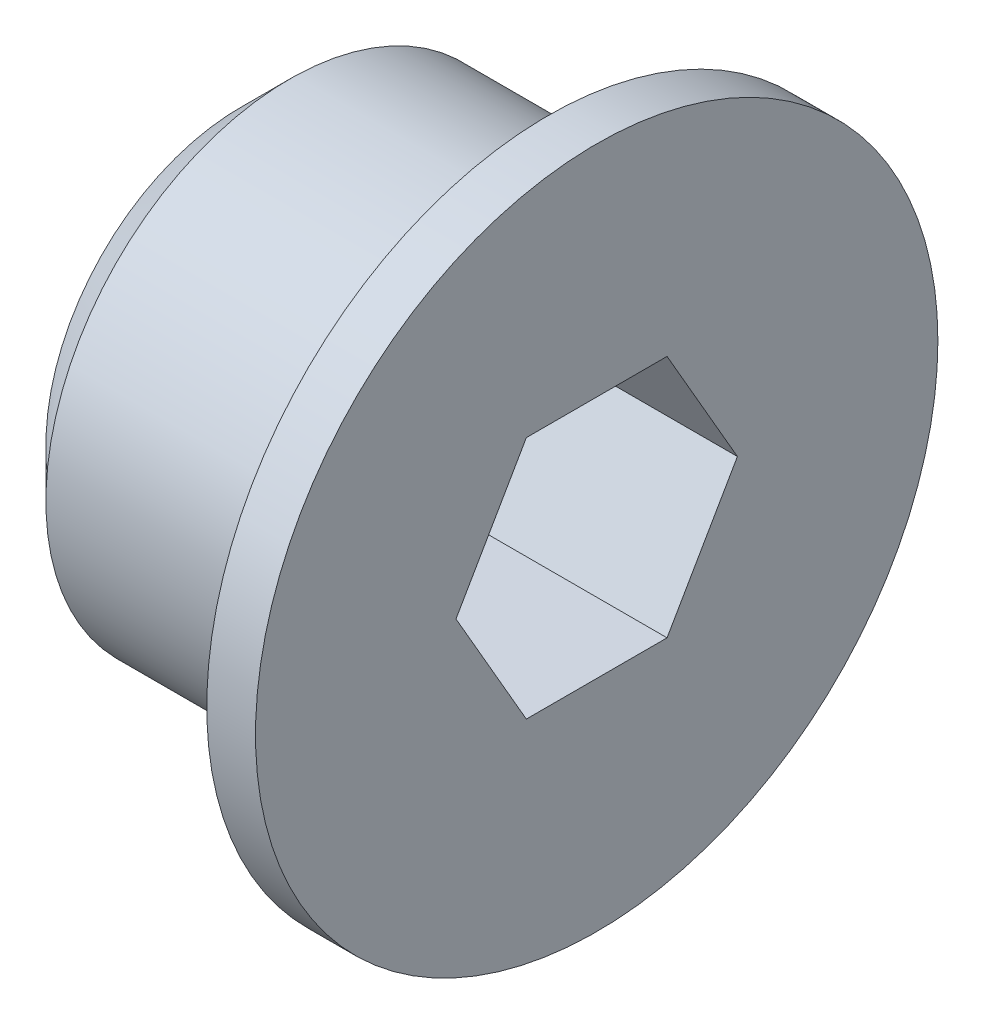
ISO-10303-21;
HEADER;
FILE_DESCRIPTION(('STEP AP214'),'2;1');
FILE_NAME('part.step','',(''),(''),'','','');
FILE_SCHEMA(('AUTOMOTIVE_DESIGN { 1 0 10303 214 1 1 1 1 }'));
ENDSEC;
DATA;
#1=APPLICATION_CONTEXT('core data for automotive mechanical design processes');
#2=APPLICATION_PROTOCOL_DEFINITION('international standard','automotive_design',2000,#1);
#3=PRODUCT_CONTEXT('',#1,'mechanical');
#4=PRODUCT('Part','Part','',(#3));
#5=PRODUCT_RELATED_PRODUCT_CATEGORY('part','',(#4));
#6=PRODUCT_DEFINITION_FORMATION('','',#4);
#7=PRODUCT_DEFINITION_CONTEXT('part definition',#1,'design');
#8=PRODUCT_DEFINITION('design','',#6,#7);
#9=PRODUCT_DEFINITION_SHAPE('','',#8);
#10=(LENGTH_UNIT() NAMED_UNIT(*) SI_UNIT(.MILLI.,.METRE.));
#11=(NAMED_UNIT(*) PLANE_ANGLE_UNIT() SI_UNIT($,.RADIAN.));
#12=(NAMED_UNIT(*) SI_UNIT($,.STERADIAN.) SOLID_ANGLE_UNIT());
#13=UNCERTAINTY_MEASURE_WITH_UNIT(LENGTH_MEASURE(1.E-05),#10,'distance_accuracy_value','');
#14=(GEOMETRIC_REPRESENTATION_CONTEXT(3) GLOBAL_UNCERTAINTY_ASSIGNED_CONTEXT((#13)) GLOBAL_UNIT_ASSIGNED_CONTEXT((#10,
#11,#12)) REPRESENTATION_CONTEXT('',''));
#15=CARTESIAN_POINT('',(0.,0.,0.));
#16=DIRECTION('',(0.,0.,1.));
#17=DIRECTION('',(1.,0.,0.));
#18=AXIS2_PLACEMENT_3D('',#15,#16,#17);
#19=CARTESIAN_POINT('',(0.,0.,0.));
#20=DIRECTION('',(1.,0.,0.));
#21=DIRECTION('',(0.,0.,-1.));
#22=AXIS2_PLACEMENT_3D('',#19,#20,#21);
#23=PLANE('',#22);
#24=CARTESIAN_POINT('',(0.,0.,0.));
#25=DIRECTION('',(1.,0.,0.));
#26=DIRECTION('',(0.,0.,-1.));
#27=AXIS2_PLACEMENT_3D('',#24,#25,#26);
#28=CIRCLE('',#27,3.99999999999999);
#29=CARTESIAN_POINT('',(0.,0.,-3.99999999999999));
#30=VERTEX_POINT('',#29);
#31=EDGE_CURVE('E11',#30,#30,#28,.F.);
#32=ORIENTED_EDGE('',*,*,#31,.T.);
#33=EDGE_LOOP('',(#32));
#34=FACE_BOUND('',#33,.T.);
#35=DIRECTION('',(0.,0.866025403784441,-0.499999999999995));
#36=VECTOR('',#35,1.);
#37=CARTESIAN_POINT('',(0.,-2.49999999999997,-1.44337567297409));
#38=LINE('',#37,#36);
#39=CARTESIAN_POINT('',(0.,-2.49999999999997,-1.44337567297409));
#40=VERTEX_POINT('',#39);
#41=CARTESIAN_POINT('',(0.,0.,-2.88675134594811));
#42=VERTEX_POINT('',#41);
#43=EDGE_CURVE('E61',#40,#42,#38,.T.);
#44=ORIENTED_EDGE('',*,*,#43,.T.);
#45=DIRECTION('',(0.,0.866025403784438,0.500000000000001));
#46=VECTOR('',#45,1.);
#47=CARTESIAN_POINT('',(0.,0.,-2.88675134594811));
#48=LINE('',#47,#46);
#49=CARTESIAN_POINT('',(0.,2.49999999999999,-1.44337567297405));
#50=VERTEX_POINT('',#49);
#51=EDGE_CURVE('E143',#42,#50,#48,.T.);
#52=ORIENTED_EDGE('',*,*,#51,.T.);
#53=DIRECTION('',(0.,0.,1.));
#54=VECTOR('',#53,1.);
#55=CARTESIAN_POINT('',(0.,2.49999999999999,-1.44337567297405));
#56=LINE('',#55,#54);
#57=CARTESIAN_POINT('',(0.,2.49999999999998,1.44337567297407));
#58=VERTEX_POINT('',#57);
#59=EDGE_CURVE('E146',#50,#58,#56,.T.);
#60=ORIENTED_EDGE('',*,*,#59,.T.);
#61=DIRECTION('',(0.,-0.866025403784442,0.499999999999995));
#62=VECTOR('',#61,1.);
#63=CARTESIAN_POINT('',(0.,2.49999999999998,1.44337567297407));
#64=LINE('',#63,#62);
#65=CARTESIAN_POINT('',(0.,0.,2.88675134594811));
#66=VERTEX_POINT('',#65);
#67=EDGE_CURVE('E108',#58,#66,#64,.T.);
#68=ORIENTED_EDGE('',*,*,#67,.T.);
#69=DIRECTION('',(0.,-0.866025403784435,-0.500000000000007));
#70=VECTOR('',#69,1.);
#71=CARTESIAN_POINT('',(0.,0.,2.88675134594811));
#72=LINE('',#71,#70);
#73=CARTESIAN_POINT('',(0.,-2.5,1.44337567297403));
#74=VERTEX_POINT('',#73);
#75=EDGE_CURVE('E149',#66,#74,#72,.T.);
#76=ORIENTED_EDGE('',*,*,#75,.T.);
#77=DIRECTION('',(0.,0.,-1.));
#78=VECTOR('',#77,1.);
#79=CARTESIAN_POINT('',(0.,-2.5,1.44337567297403));
#80=LINE('',#79,#78);
#81=EDGE_CURVE('E152',#74,#40,#80,.T.);
#82=ORIENTED_EDGE('',*,*,#81,.T.);
#83=EDGE_LOOP('',(#44,#52,#60,#68,#76,#82));
#84=FACE_BOUND('',#83,.T.);
#85=ADVANCED_FACE('F45',(#34,#84),#23,.F.);
#86=CARTESIAN_POINT('',(6.3,0.,0.));
#87=DIRECTION('',(-1.,0.,0.));
#88=DIRECTION('',(0.,0.,1.));
#89=AXIS2_PLACEMENT_3D('',#86,#87,#88);
#90=CYLINDRICAL_SURFACE('',#89,5.);
#91=CARTESIAN_POINT('',(1.,0.,0.));
#92=DIRECTION('',(1.,0.,0.));
#93=DIRECTION('',(0.,0.,-1.));
#94=AXIS2_PLACEMENT_3D('',#91,#92,#93);
#95=CIRCLE('',#94,5.);
#96=CARTESIAN_POINT('',(1.,0.,-5.));
#97=VERTEX_POINT('',#96);
#98=EDGE_CURVE('E54',#97,#97,#95,.T.);
#99=ORIENTED_EDGE('',*,*,#98,.T.);
#100=EDGE_LOOP('',(#99));
#101=FACE_BOUND('',#100,.T.);
#102=CARTESIAN_POINT('',(6.3,0.,0.));
#103=DIRECTION('',(1.,0.,0.));
#104=DIRECTION('',(0.,0.,-1.));
#105=AXIS2_PLACEMENT_3D('',#102,#103,#104);
#106=CIRCLE('',#105,5.);
#107=CARTESIAN_POINT('',(6.3,0.,-5.));
#108=VERTEX_POINT('',#107);
#109=EDGE_CURVE('E162',#108,#108,#106,.T.);
#110=ORIENTED_EDGE('',*,*,#109,.F.);
#111=EDGE_LOOP('',(#110));
#112=FACE_BOUND('',#111,.T.);
#113=ADVANCED_FACE('F167',(#101,#112),#90,.T.);
#114=CARTESIAN_POINT('',(6.3,-2.49999999999997,-1.44337567297409));
#115=DIRECTION('',(0.,0.499999999999995,0.866025403784441));
#116=DIRECTION('',(0.,-0.866025403784441,0.499999999999995));
#117=AXIS2_PLACEMENT_3D('',#114,#115,#116);
#118=PLANE('',#117);
#119=ORIENTED_EDGE('',*,*,#43,.F.);
#120=DIRECTION('',(-1.,0.,0.));
#121=VECTOR('',#120,1.);
#122=CARTESIAN_POINT('',(6.3,-2.49999999999997,-1.44337567297409));
#123=LINE('',#122,#121);
#124=CARTESIAN_POINT('',(7.3,-2.49999999999997,-1.44337567297409));
#125=VERTEX_POINT('',#124);
#126=EDGE_CURVE('E155',#125,#40,#123,.T.);
#127=ORIENTED_EDGE('',*,*,#126,.F.);
#128=DIRECTION('',(0.,0.866025403784441,-0.499999999999995));
#129=VECTOR('',#128,1.);
#130=CARTESIAN_POINT('',(7.3,-2.49999999999997,-1.44337567297409));
#131=LINE('',#130,#129);
#132=CARTESIAN_POINT('',(7.3,0.,-2.88675134594811));
#133=VERTEX_POINT('',#132);
#134=EDGE_CURVE('E131',#125,#133,#131,.T.);
#135=ORIENTED_EDGE('',*,*,#134,.T.);
#136=DIRECTION('',(-1.,0.,0.));
#137=VECTOR('',#136,1.);
#138=CARTESIAN_POINT('',(6.3,0.,-2.88675134594811));
#139=LINE('',#138,#137);
#140=EDGE_CURVE('E160',#133,#42,#139,.T.);
#141=ORIENTED_EDGE('',*,*,#140,.T.);
#142=EDGE_LOOP('',(#119,#127,#135,#141));
#143=FACE_BOUND('',#142,.T.);
#144=ADVANCED_FACE('F186',(#143),#118,.T.);
#145=CARTESIAN_POINT('',(6.3,0.,-2.88675134594811));
#146=DIRECTION('',(0.,-0.500000000000001,0.866025403784438));
#147=DIRECTION('',(0.,-0.866025403784438,-0.500000000000001));
#148=AXIS2_PLACEMENT_3D('',#145,#146,#147);
#149=PLANE('',#148);
#150=ORIENTED_EDGE('',*,*,#51,.F.);
#151=ORIENTED_EDGE('',*,*,#140,.F.);
#152=DIRECTION('',(0.,0.866025403784438,0.500000000000001));
#153=VECTOR('',#152,1.);
#154=CARTESIAN_POINT('',(7.3,0.,-2.88675134594811));
#155=LINE('',#154,#153);
#156=CARTESIAN_POINT('',(7.3,2.49999999999999,-1.44337567297405));
#157=VERTEX_POINT('',#156);
#158=EDGE_CURVE('E134',#133,#157,#155,.T.);
#159=ORIENTED_EDGE('',*,*,#158,.T.);
#160=DIRECTION('',(-1.,0.,0.));
#161=VECTOR('',#160,1.);
#162=CARTESIAN_POINT('',(6.3,2.49999999999999,-1.44337567297405));
#163=LINE('',#162,#161);
#164=EDGE_CURVE('E112',#157,#50,#163,.T.);
#165=ORIENTED_EDGE('',*,*,#164,.T.);
#166=EDGE_LOOP('',(#150,#151,#159,#165));
#167=FACE_BOUND('',#166,.T.);
#168=ADVANCED_FACE('F191',(#167),#149,.T.);
#169=CARTESIAN_POINT('',(6.3,2.49999999999999,-1.44337567297405));
#170=DIRECTION('',(0.,-1.,0.));
#171=DIRECTION('',(0.,0.,-1.));
#172=AXIS2_PLACEMENT_3D('',#169,#170,#171);
#173=PLANE('',#172);
#174=ORIENTED_EDGE('',*,*,#59,.F.);
#175=ORIENTED_EDGE('',*,*,#164,.F.);
#176=DIRECTION('',(0.,0.,1.));
#177=VECTOR('',#176,1.);
#178=CARTESIAN_POINT('',(7.3,2.49999999999999,-1.44337567297405));
#179=LINE('',#178,#177);
#180=CARTESIAN_POINT('',(7.3,2.49999999999998,1.44337567297407));
#181=VERTEX_POINT('',#180);
#182=EDGE_CURVE('E116',#157,#181,#179,.T.);
#183=ORIENTED_EDGE('',*,*,#182,.T.);
#184=DIRECTION('',(-1.,0.,0.));
#185=VECTOR('',#184,1.);
#186=CARTESIAN_POINT('',(6.3,2.49999999999998,1.44337567297407));
#187=LINE('',#186,#185);
#188=EDGE_CURVE('E101',#181,#58,#187,.T.);
#189=ORIENTED_EDGE('',*,*,#188,.T.);
#190=EDGE_LOOP('',(#174,#175,#183,#189));
#191=FACE_BOUND('',#190,.T.);
#192=ADVANCED_FACE('F117',(#191),#173,.T.);
#193=CARTESIAN_POINT('',(6.3,2.49999999999998,1.44337567297407));
#194=DIRECTION('',(0.,-0.499999999999995,-0.866025403784441));
#195=DIRECTION('',(0.,0.866025403784442,-0.499999999999995));
#196=AXIS2_PLACEMENT_3D('',#193,#194,#195);
#197=PLANE('',#196);
#198=ORIENTED_EDGE('',*,*,#67,.F.);
#199=ORIENTED_EDGE('',*,*,#188,.F.);
#200=DIRECTION('',(0.,-0.866025403784442,0.499999999999995));
#201=VECTOR('',#200,1.);
#202=CARTESIAN_POINT('',(7.3,2.49999999999998,1.44337567297407));
#203=LINE('',#202,#201);
#204=CARTESIAN_POINT('',(7.3,0.,2.88675134594811));
#205=VERTEX_POINT('',#204);
#206=EDGE_CURVE('E105',#181,#205,#203,.T.);
#207=ORIENTED_EDGE('',*,*,#206,.T.);
#208=DIRECTION('',(-1.,0.,0.));
#209=VECTOR('',#208,1.);
#210=CARTESIAN_POINT('',(6.3,0.,2.88675134594811));
#211=LINE('',#210,#209);
#212=EDGE_CURVE('E113',#205,#66,#211,.T.);
#213=ORIENTED_EDGE('',*,*,#212,.T.);
#214=EDGE_LOOP('',(#198,#199,#207,#213));
#215=FACE_BOUND('',#214,.T.);
#216=ADVANCED_FACE('F103',(#215),#197,.T.);
#217=CARTESIAN_POINT('',(6.3,0.,2.88675134594811));
#218=DIRECTION('',(0.,0.500000000000007,-0.866025403784435));
#219=DIRECTION('',(0.,0.866025403784435,0.500000000000007));
#220=AXIS2_PLACEMENT_3D('',#217,#218,#219);
#221=PLANE('',#220);
#222=ORIENTED_EDGE('',*,*,#75,.F.);
#223=ORIENTED_EDGE('',*,*,#212,.F.);
#224=DIRECTION('',(0.,-0.866025403784435,-0.500000000000007));
#225=VECTOR('',#224,1.);
#226=CARTESIAN_POINT('',(7.3,0.,2.88675134594811));
#227=LINE('',#226,#225);
#228=CARTESIAN_POINT('',(7.3,-2.5,1.44337567297403));
#229=VERTEX_POINT('',#228);
#230=EDGE_CURVE('E124',#205,#229,#227,.T.);
#231=ORIENTED_EDGE('',*,*,#230,.T.);
#232=DIRECTION('',(-1.,0.,0.));
#233=VECTOR('',#232,1.);
#234=CARTESIAN_POINT('',(6.3,-2.5,1.44337567297403));
#235=LINE('',#234,#233);
#236=EDGE_CURVE('E69',#229,#74,#235,.T.);
#237=ORIENTED_EDGE('',*,*,#236,.T.);
#238=EDGE_LOOP('',(#222,#223,#231,#237));
#239=FACE_BOUND('',#238,.T.);
#240=ADVANCED_FACE('F199',(#239),#221,.T.);
#241=CARTESIAN_POINT('',(6.3,-2.5,1.44337567297403));
#242=DIRECTION('',(0.,1.,0.));
#243=DIRECTION('',(0.,0.,1.));
#244=AXIS2_PLACEMENT_3D('',#241,#242,#243);
#245=PLANE('',#244);
#246=ORIENTED_EDGE('',*,*,#81,.F.);
#247=ORIENTED_EDGE('',*,*,#236,.F.);
#248=DIRECTION('',(0.,0.,-1.));
#249=VECTOR('',#248,1.);
#250=CARTESIAN_POINT('',(7.3,-2.5,1.44337567297403));
#251=LINE('',#250,#249);
#252=EDGE_CURVE('E126',#229,#125,#251,.T.);
#253=ORIENTED_EDGE('',*,*,#252,.T.);
#254=ORIENTED_EDGE('',*,*,#126,.T.);
#255=EDGE_LOOP('',(#246,#247,#253,#254));
#256=FACE_BOUND('',#255,.T.);
#257=ADVANCED_FACE('F202',(#256),#245,.T.);
#258=CARTESIAN_POINT('',(7.3,0.,0.));
#259=DIRECTION('',(1.,0.,0.));
#260=DIRECTION('',(0.,0.,-1.));
#261=AXIS2_PLACEMENT_3D('',#258,#259,#260);
#262=PLANE('',#261);
#263=CARTESIAN_POINT('',(7.3,0.,0.));
#264=DIRECTION('',(1.,0.,0.));
#265=DIRECTION('',(0.,0.,-1.));
#266=AXIS2_PLACEMENT_3D('',#263,#264,#265);
#267=CIRCLE('',#266,7.);
#268=CARTESIAN_POINT('',(7.3,0.,-7.));
#269=VERTEX_POINT('',#268);
#270=EDGE_CURVE('E137',#269,#269,#267,.T.);
#271=ORIENTED_EDGE('',*,*,#270,.T.);
#272=EDGE_LOOP('',(#271));
#273=FACE_BOUND('',#272,.T.);
#274=ORIENTED_EDGE('',*,*,#206,.F.);
#275=ORIENTED_EDGE('',*,*,#182,.F.);
#276=ORIENTED_EDGE('',*,*,#158,.F.);
#277=ORIENTED_EDGE('',*,*,#134,.F.);
#278=ORIENTED_EDGE('',*,*,#252,.F.);
#279=ORIENTED_EDGE('',*,*,#230,.F.);
#280=EDGE_LOOP('',(#274,#275,#276,#277,#278,#279));
#281=FACE_BOUND('',#280,.T.);
#282=ADVANCED_FACE('F122',(#273,#281),#262,.T.);
#283=CARTESIAN_POINT('',(6.3,0.,0.));
#284=DIRECTION('',(1.,0.,0.));
#285=DIRECTION('',(0.,0.,-1.));
#286=AXIS2_PLACEMENT_3D('',#283,#284,#285);
#287=PLANE('',#286);
#288=ORIENTED_EDGE('',*,*,#109,.T.);
#289=EDGE_LOOP('',(#288));
#290=FACE_BOUND('',#289,.T.);
#291=CARTESIAN_POINT('',(6.3,0.,0.));
#292=DIRECTION('',(1.,0.,0.));
#293=DIRECTION('',(0.,0.,-1.));
#294=AXIS2_PLACEMENT_3D('',#291,#292,#293);
#295=CIRCLE('',#294,7.);
#296=CARTESIAN_POINT('',(6.3,0.,-7.));
#297=VERTEX_POINT('',#296);
#298=EDGE_CURVE('E136',#297,#297,#295,.T.);
#299=ORIENTED_EDGE('',*,*,#298,.F.);
#300=EDGE_LOOP('',(#299));
#301=FACE_BOUND('',#300,.T.);
#302=ADVANCED_FACE('F177',(#290,#301),#287,.F.);
#303=CARTESIAN_POINT('',(7.3,0.,0.));
#304=DIRECTION('',(-1.,0.,0.));
#305=DIRECTION('',(0.,0.,1.));
#306=AXIS2_PLACEMENT_3D('',#303,#304,#305);
#307=CYLINDRICAL_SURFACE('',#306,7.);
#308=ORIENTED_EDGE('',*,*,#270,.F.);
#309=EDGE_LOOP('',(#308));
#310=FACE_BOUND('',#309,.T.);
#311=ORIENTED_EDGE('',*,*,#298,.T.);
#312=EDGE_LOOP('',(#311));
#313=FACE_BOUND('',#312,.T.);
#314=ADVANCED_FACE('F171',(#310,#313),#307,.T.);
#315=CARTESIAN_POINT('',(1.,0.,0.));
#316=DIRECTION('',(1.,0.,0.));
#317=DIRECTION('',(0.,0.,-1.));
#318=AXIS2_PLACEMENT_3D('',#315,#316,#317);
#319=CONICAL_SURFACE('',#318,5.,0.78539816339745);
#320=ORIENTED_EDGE('',*,*,#31,.F.);
#321=EDGE_LOOP('',(#320));
#322=FACE_BOUND('',#321,.T.);
#323=ORIENTED_EDGE('',*,*,#98,.F.);
#324=EDGE_LOOP('',(#323));
#325=FACE_BOUND('',#324,.T.);
#326=ADVANCED_FACE('F48',(#322,#325),#319,.T.);
#327=CLOSED_SHELL('',(#85,#113,#144,#168,#192,#216,#240,#257,#282,#302,#314,#326));
#328=MANIFOLD_SOLID_BREP('B2',#327);
#329=ADVANCED_BREP_SHAPE_REPRESENTATION('',(#18,#328),#14);
#330=SHAPE_DEFINITION_REPRESENTATION(#9,#329);
ENDSEC;
END-ISO-10303-21;
